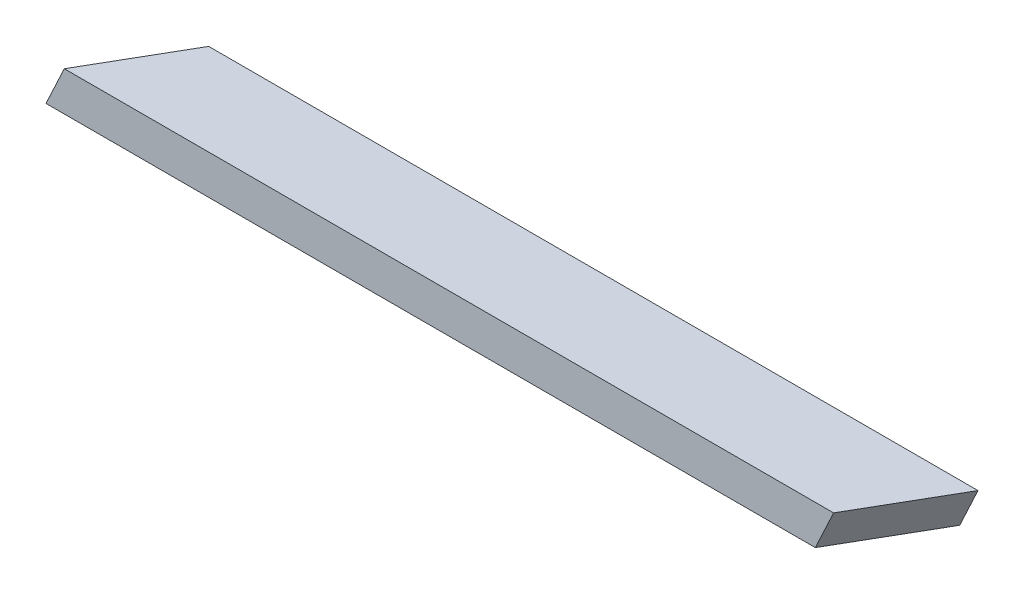
ISO-10303-21;
HEADER;
FILE_DESCRIPTION(('STEP AP214'),'2;1');
FILE_NAME('part.step','',(''),(''),'','','');
FILE_SCHEMA(('AUTOMOTIVE_DESIGN { 1 0 10303 214 1 1 1 1 }'));
ENDSEC;
DATA;
#1=APPLICATION_CONTEXT('core data for automotive mechanical design processes');
#2=APPLICATION_PROTOCOL_DEFINITION('international standard','automotive_design',2000,#1);
#3=PRODUCT_CONTEXT('',#1,'mechanical');
#4=PRODUCT('Part','Part','',(#3));
#5=PRODUCT_RELATED_PRODUCT_CATEGORY('part','',(#4));
#6=PRODUCT_DEFINITION_FORMATION('','',#4);
#7=PRODUCT_DEFINITION_CONTEXT('part definition',#1,'design');
#8=PRODUCT_DEFINITION('design','',#6,#7);
#9=PRODUCT_DEFINITION_SHAPE('','',#8);
#10=(LENGTH_UNIT() NAMED_UNIT(*) SI_UNIT(.MILLI.,.METRE.));
#11=(NAMED_UNIT(*) PLANE_ANGLE_UNIT() SI_UNIT($,.RADIAN.));
#12=(NAMED_UNIT(*) SI_UNIT($,.STERADIAN.) SOLID_ANGLE_UNIT());
#13=UNCERTAINTY_MEASURE_WITH_UNIT(LENGTH_MEASURE(1.E-05),#10,'distance_accuracy_value','');
#14=(GEOMETRIC_REPRESENTATION_CONTEXT(3) GLOBAL_UNCERTAINTY_ASSIGNED_CONTEXT((#13)) GLOBAL_UNIT_ASSIGNED_CONTEXT((#10,
#11,#12)) REPRESENTATION_CONTEXT('',''));
#15=CARTESIAN_POINT('',(0.,0.,0.));
#16=DIRECTION('',(0.,0.,1.));
#17=DIRECTION('',(1.,0.,0.));
#18=AXIS2_PLACEMENT_3D('',#15,#16,#17);
#19=CARTESIAN_POINT('',(-297.697291582993,162.752438416483,-44.45));
#20=DIRECTION('',(0.803018297611852,-0.374453581815,0.463622830290399));
#21=DIRECTION('',(0.500000000000001,0.,-0.866025403784438));
#22=AXIS2_PLACEMENT_3D('',#19,#20,#21);
#23=PLANE('',#22);
#24=DIRECTION('',(0.422618261740703,0.906307787036648,0.));
#25=VECTOR('',#24,1.);
#26=CARTESIAN_POINT('',(-349.023730513951,162.752438416483,44.45));
#27=LINE('',#26,#25);
#28=CARTESIAN_POINT('',(-424.916438930957,0.,44.45));
#29=VERTEX_POINT('',#28);
#30=CARTESIAN_POINT('',(-407.150117155252,38.1,44.45));
#31=VERTEX_POINT('',#30);
#32=EDGE_CURVE('E110',#29,#31,#27,.T.);
#33=ORIENTED_EDGE('',*,*,#32,.T.);
#34=DIRECTION('',(-0.500000000000001,0.,0.866025403784438));
#35=VECTOR('',#34,1.);
#36=CARTESIAN_POINT('',(-355.823678224294,38.1,-44.45));
#37=LINE('',#36,#35);
#38=CARTESIAN_POINT('',(-355.823678224294,38.1,-44.45));
#39=VERTEX_POINT('',#38);
#40=EDGE_CURVE('E11',#39,#31,#37,.T.);
#41=ORIENTED_EDGE('',*,*,#40,.F.);
#42=DIRECTION('',(0.422618261740703,0.906307787036648,0.));
#43=VECTOR('',#42,1.);
#44=CARTESIAN_POINT('',(-297.697291582993,162.752438416483,-44.45));
#45=LINE('',#44,#43);
#46=CARTESIAN_POINT('',(-373.59,0.,-44.45));
#47=VERTEX_POINT('',#46);
#48=EDGE_CURVE('E62',#47,#39,#45,.T.);
#49=ORIENTED_EDGE('',*,*,#48,.F.);
#50=DIRECTION('',(-0.500000000000001,0.,0.866025403784438));
#51=VECTOR('',#50,1.);
#52=CARTESIAN_POINT('',(-373.59,0.,-44.45));
#53=LINE('',#52,#51);
#54=EDGE_CURVE('E46',#47,#29,#53,.T.);
#55=ORIENTED_EDGE('',*,*,#54,.T.);
#56=EDGE_LOOP('',(#33,#41,#49,#55));
#57=FACE_BOUND('',#56,.T.);
#58=ADVANCED_FACE('F43',(#57),#23,.F.);
#59=CARTESIAN_POINT('',(51.3264389309578,38.1000000000001,-44.45));
#60=DIRECTION('',(0.,1.,0.));
#61=DIRECTION('',(-1.,0.,0.));
#62=AXIS2_PLACEMENT_3D('',#59,#60,#61);
#63=PLANE('',#62);
#64=DIRECTION('',(-1.,0.,0.));
#65=VECTOR('',#64,1.);
#66=CARTESIAN_POINT('',(0.,38.1000000000001,44.45));
#67=LINE('',#66,#65);
#68=CARTESIAN_POINT('',(340.029882844748,38.1000000000001,44.45));
#69=VERTEX_POINT('',#68);
#70=EDGE_CURVE('E118',#69,#31,#67,.T.);
#71=ORIENTED_EDGE('',*,*,#70,.F.);
#72=DIRECTION('',(-0.500000000000001,0.,0.866025403784438));
#73=VECTOR('',#72,1.);
#74=CARTESIAN_POINT('',(391.356321775706,38.1000000000001,-44.45));
#75=LINE('',#74,#73);
#76=CARTESIAN_POINT('',(391.356321775706,38.1000000000001,-44.45));
#77=VERTEX_POINT('',#76);
#78=EDGE_CURVE('E53',#77,#69,#75,.T.);
#79=ORIENTED_EDGE('',*,*,#78,.F.);
#80=DIRECTION('',(-1.,0.,0.));
#81=VECTOR('',#80,1.);
#82=CARTESIAN_POINT('',(51.3264389309578,38.1000000000001,-44.45));
#83=LINE('',#82,#81);
#84=EDGE_CURVE('E103',#77,#39,#83,.T.);
#85=ORIENTED_EDGE('',*,*,#84,.T.);
#86=ORIENTED_EDGE('',*,*,#40,.T.);
#87=EDGE_LOOP('',(#71,#79,#85,#86));
#88=FACE_BOUND('',#87,.T.);
#89=ADVANCED_FACE('F128',(#88),#63,.T.);
#90=CARTESIAN_POINT('',(316.031731519799,-123.434105088338,-44.45));
#91=DIRECTION('',(0.803018297611852,-0.374453581815001,0.463622830290399));
#92=DIRECTION('',(0.500000000000001,0.,-0.866025403784438));
#93=AXIS2_PLACEMENT_3D('',#90,#91,#92);
#94=PLANE('',#93);
#95=DIRECTION('',(0.422618261740703,0.906307787036648,0.));
#96=VECTOR('',#95,1.);
#97=CARTESIAN_POINT('',(264.705292588841,-123.434105088338,44.45));
#98=LINE('',#97,#96);
#99=CARTESIAN_POINT('',(322.263561069043,0.,44.45));
#100=VERTEX_POINT('',#99);
#101=EDGE_CURVE('E94',#100,#69,#98,.T.);
#102=ORIENTED_EDGE('',*,*,#101,.F.);
#103=DIRECTION('',(-0.500000000000001,0.,0.866025403784438));
#104=VECTOR('',#103,1.);
#105=CARTESIAN_POINT('',(373.59,0.,-44.45));
#106=LINE('',#105,#104);
#107=CARTESIAN_POINT('',(373.59,0.,-44.45));
#108=VERTEX_POINT('',#107);
#109=EDGE_CURVE('E91',#108,#100,#106,.T.);
#110=ORIENTED_EDGE('',*,*,#109,.F.);
#111=DIRECTION('',(0.422618261740703,0.906307787036648,0.));
#112=VECTOR('',#111,1.);
#113=CARTESIAN_POINT('',(316.031731519799,-123.434105088338,-44.45));
#114=LINE('',#113,#112);
#115=EDGE_CURVE('E93',#108,#77,#114,.T.);
#116=ORIENTED_EDGE('',*,*,#115,.T.);
#117=ORIENTED_EDGE('',*,*,#78,.T.);
#118=EDGE_LOOP('',(#102,#110,#116,#117));
#119=FACE_BOUND('',#118,.T.);
#120=ADVANCED_FACE('F92',(#119),#94,.T.);
#121=CARTESIAN_POINT('',(51.3264389309578,0.,-44.45));
#122=DIRECTION('',(0.,1.,0.));
#123=DIRECTION('',(0.,0.,1.));
#124=AXIS2_PLACEMENT_3D('',#121,#122,#123);
#125=PLANE('',#124);
#126=DIRECTION('',(-1.,0.,0.));
#127=VECTOR('',#126,1.);
#128=CARTESIAN_POINT('',(0.,0.,44.45));
#129=LINE('',#128,#127);
#130=EDGE_CURVE('E113',#100,#29,#129,.T.);
#131=ORIENTED_EDGE('',*,*,#130,.T.);
#132=ORIENTED_EDGE('',*,*,#54,.F.);
#133=DIRECTION('',(-1.,0.,0.));
#134=VECTOR('',#133,1.);
#135=CARTESIAN_POINT('',(51.3264389309578,0.,-44.45));
#136=LINE('',#135,#134);
#137=EDGE_CURVE('E88',#108,#47,#136,.T.);
#138=ORIENTED_EDGE('',*,*,#137,.F.);
#139=ORIENTED_EDGE('',*,*,#109,.T.);
#140=EDGE_LOOP('',(#131,#132,#138,#139));
#141=FACE_BOUND('',#140,.T.);
#142=ADVANCED_FACE('F98',(#141),#125,.F.);
#143=CARTESIAN_POINT('',(51.3264389309578,0.,-44.45));
#144=DIRECTION('',(0.,0.,1.));
#145=DIRECTION('',(1.,0.,0.));
#146=AXIS2_PLACEMENT_3D('',#143,#144,#145);
#147=PLANE('',#146);
#148=ORIENTED_EDGE('',*,*,#48,.T.);
#149=ORIENTED_EDGE('',*,*,#84,.F.);
#150=ORIENTED_EDGE('',*,*,#115,.F.);
#151=ORIENTED_EDGE('',*,*,#137,.T.);
#152=EDGE_LOOP('',(#148,#149,#150,#151));
#153=FACE_BOUND('',#152,.T.);
#154=ADVANCED_FACE('F102',(#153),#147,.F.);
#155=CARTESIAN_POINT('',(0.,0.,44.45));
#156=DIRECTION('',(0.,0.,1.));
#157=DIRECTION('',(1.,0.,0.));
#158=AXIS2_PLACEMENT_3D('',#155,#156,#157);
#159=PLANE('',#158);
#160=ORIENTED_EDGE('',*,*,#32,.F.);
#161=ORIENTED_EDGE('',*,*,#130,.F.);
#162=ORIENTED_EDGE('',*,*,#101,.T.);
#163=ORIENTED_EDGE('',*,*,#70,.T.);
#164=EDGE_LOOP('',(#160,#161,#162,#163));
#165=FACE_BOUND('',#164,.T.);
#166=ADVANCED_FACE('F127',(#165),#159,.T.);
#167=CLOSED_SHELL('',(#58,#89,#120,#142,#154,#166));
#168=MANIFOLD_SOLID_BREP('B2',#167);
#169=ADVANCED_BREP_SHAPE_REPRESENTATION('',(#18,#168),#14);
#170=SHAPE_DEFINITION_REPRESENTATION(#9,#169);
ENDSEC;
END-ISO-10303-21;
